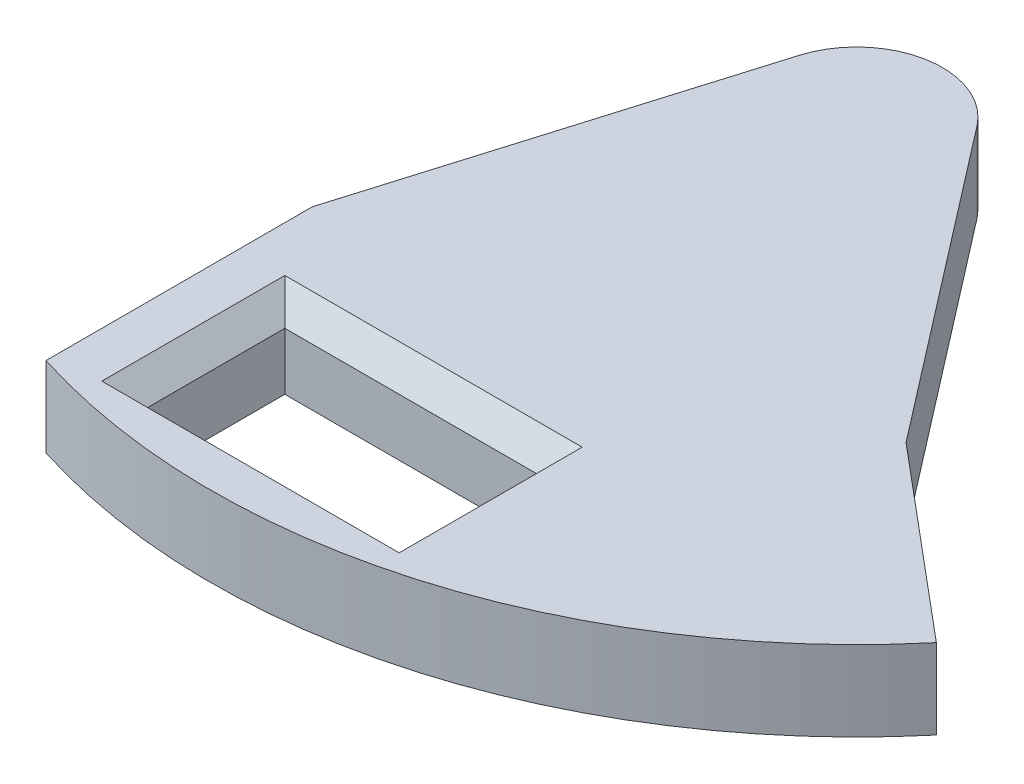
ISO-10303-21;
HEADER;
FILE_DESCRIPTION(('STEP AP214'),'2;1');
FILE_NAME('part.step','',(''),(''),'','','');
FILE_SCHEMA(('AUTOMOTIVE_DESIGN { 1 0 10303 214 1 1 1 1 }'));
ENDSEC;
DATA;
#1=APPLICATION_CONTEXT('core data for automotive mechanical design processes');
#2=APPLICATION_PROTOCOL_DEFINITION('international standard','automotive_design',2000,#1);
#3=PRODUCT_CONTEXT('',#1,'mechanical');
#4=PRODUCT('Part','Part','',(#3));
#5=PRODUCT_RELATED_PRODUCT_CATEGORY('part','',(#4));
#6=PRODUCT_DEFINITION_FORMATION('','',#4);
#7=PRODUCT_DEFINITION_CONTEXT('part definition',#1,'design');
#8=PRODUCT_DEFINITION('design','',#6,#7);
#9=PRODUCT_DEFINITION_SHAPE('','',#8);
#10=(LENGTH_UNIT() NAMED_UNIT(*) SI_UNIT(.MILLI.,.METRE.));
#11=(NAMED_UNIT(*) PLANE_ANGLE_UNIT() SI_UNIT($,.RADIAN.));
#12=(NAMED_UNIT(*) SI_UNIT($,.STERADIAN.) SOLID_ANGLE_UNIT());
#13=UNCERTAINTY_MEASURE_WITH_UNIT(LENGTH_MEASURE(1.E-05),#10,'distance_accuracy_value','');
#14=(GEOMETRIC_REPRESENTATION_CONTEXT(3) GLOBAL_UNCERTAINTY_ASSIGNED_CONTEXT((#13)) GLOBAL_UNIT_ASSIGNED_CONTEXT((#10,
#11,#12)) REPRESENTATION_CONTEXT('',''));
#15=CARTESIAN_POINT('',(0.,0.,0.));
#16=DIRECTION('',(0.,0.,1.));
#17=DIRECTION('',(1.,0.,0.));
#18=AXIS2_PLACEMENT_3D('',#15,#16,#17);
#19=CARTESIAN_POINT('',(0.,7.,-6.));
#20=DIRECTION('',(0.,0.,-1.));
#21=DIRECTION('',(-1.,0.,0.));
#22=AXIS2_PLACEMENT_3D('',#19,#20,#21);
#23=PLANE('',#22);
#24=DIRECTION('',(0.,-1.,0.));
#25=VECTOR('',#24,1.);
#26=CARTESIAN_POINT('',(11.,7.,-6.));
#27=LINE('',#26,#25);
#28=CARTESIAN_POINT('',(11.,4.99999999999998,-6.));
#29=VERTEX_POINT('',#28);
#30=CARTESIAN_POINT('',(11.,0.,-6.));
#31=VERTEX_POINT('',#30);
#32=EDGE_CURVE('E201',#29,#31,#27,.T.);
#33=ORIENTED_EDGE('',*,*,#32,.F.);
#34=DIRECTION('',(-1.,0.,0.));
#35=VECTOR('',#34,1.);
#36=CARTESIAN_POINT('',(-11.,4.99999999999998,-6.));
#37=LINE('',#36,#35);
#38=CARTESIAN_POINT('',(-11.,4.99999999999998,-6.));
#39=VERTEX_POINT('',#38);
#40=EDGE_CURVE('E11',#29,#39,#37,.T.);
#41=ORIENTED_EDGE('',*,*,#40,.T.);
#42=DIRECTION('',(0.,-1.,0.));
#43=VECTOR('',#42,1.);
#44=CARTESIAN_POINT('',(-11.,7.,-6.));
#45=LINE('',#44,#43);
#46=CARTESIAN_POINT('',(-11.,0.,-6.));
#47=VERTEX_POINT('',#46);
#48=EDGE_CURVE('E148',#39,#47,#45,.T.);
#49=ORIENTED_EDGE('',*,*,#48,.T.);
#50=DIRECTION('',(1.,0.,0.));
#51=VECTOR('',#50,1.);
#52=CARTESIAN_POINT('',(0.,0.,-6.));
#53=LINE('',#52,#51);
#54=EDGE_CURVE('E188',#47,#31,#53,.T.);
#55=ORIENTED_EDGE('',*,*,#54,.T.);
#56=EDGE_LOOP('',(#33,#41,#49,#55));
#57=FACE_BOUND('',#56,.T.);
#58=ADVANCED_FACE('F47',(#57),#23,.F.);
#59=CARTESIAN_POINT('',(11.,7.,0.));
#60=DIRECTION('',(1.,0.,0.));
#61=DIRECTION('',(0.,0.,-1.));
#62=AXIS2_PLACEMENT_3D('',#59,#60,#61);
#63=PLANE('',#62);
#64=DIRECTION('',(0.,-1.,0.));
#65=VECTOR('',#64,1.);
#66=CARTESIAN_POINT('',(11.,7.,6.));
#67=LINE('',#66,#65);
#68=CARTESIAN_POINT('',(11.,4.99999999999998,6.));
#69=VERTEX_POINT('',#68);
#70=CARTESIAN_POINT('',(11.,0.,6.));
#71=VERTEX_POINT('',#70);
#72=EDGE_CURVE('E199',#69,#71,#67,.T.);
#73=ORIENTED_EDGE('',*,*,#72,.F.);
#74=DIRECTION('',(0.,0.,-1.));
#75=VECTOR('',#74,1.);
#76=CARTESIAN_POINT('',(11.,4.99999999999998,-6.));
#77=LINE('',#76,#75);
#78=EDGE_CURVE('E57',#69,#29,#77,.T.);
#79=ORIENTED_EDGE('',*,*,#78,.T.);
#80=ORIENTED_EDGE('',*,*,#32,.T.);
#81=DIRECTION('',(0.,0.,1.));
#82=VECTOR('',#81,1.);
#83=CARTESIAN_POINT('',(11.,0.,0.));
#84=LINE('',#83,#82);
#85=EDGE_CURVE('E191',#31,#71,#84,.T.);
#86=ORIENTED_EDGE('',*,*,#85,.T.);
#87=EDGE_LOOP('',(#73,#79,#80,#86));
#88=FACE_BOUND('',#87,.T.);
#89=ADVANCED_FACE('F262',(#88),#63,.F.);
#90=CARTESIAN_POINT('',(0.,7.,6.));
#91=DIRECTION('',(0.,0.,-1.));
#92=DIRECTION('',(-1.,0.,0.));
#93=AXIS2_PLACEMENT_3D('',#90,#91,#92);
#94=PLANE('',#93);
#95=DIRECTION('',(0.,-1.,0.));
#96=VECTOR('',#95,1.);
#97=CARTESIAN_POINT('',(-11.,7.,6.));
#98=LINE('',#97,#96);
#99=CARTESIAN_POINT('',(-11.,4.99999999999998,6.));
#100=VERTEX_POINT('',#99);
#101=CARTESIAN_POINT('',(-11.,0.,6.));
#102=VERTEX_POINT('',#101);
#103=EDGE_CURVE('E197',#100,#102,#98,.T.);
#104=ORIENTED_EDGE('',*,*,#103,.F.);
#105=DIRECTION('',(1.,0.,0.));
#106=VECTOR('',#105,1.);
#107=CARTESIAN_POINT('',(0.,4.99999999999998,6.));
#108=LINE('',#107,#106);
#109=EDGE_CURVE('E72',#100,#69,#108,.T.);
#110=ORIENTED_EDGE('',*,*,#109,.T.);
#111=ORIENTED_EDGE('',*,*,#72,.T.);
#112=DIRECTION('',(1.,0.,0.));
#113=VECTOR('',#112,1.);
#114=CARTESIAN_POINT('',(0.,0.,6.));
#115=LINE('',#114,#113);
#116=EDGE_CURVE('E165',#102,#71,#115,.T.);
#117=ORIENTED_EDGE('',*,*,#116,.F.);
#118=EDGE_LOOP('',(#104,#110,#111,#117));
#119=FACE_BOUND('',#118,.T.);
#120=ADVANCED_FACE('F256',(#119),#94,.T.);
#121=CARTESIAN_POINT('',(27.6988737189503,7.,-21.3513240143334));
#122=DIRECTION('',(0.79200869217496,0.,-0.610509812795265));
#123=DIRECTION('',(-0.610509812795265,0.,-0.79200869217496));
#124=AXIS2_PLACEMENT_3D('',#121,#122,#123);
#125=PLANE('',#124);
#126=DIRECTION('',(0.610509812795265,0.,0.79200869217496));
#127=VECTOR('',#126,1.);
#128=CARTESIAN_POINT('',(27.6988737189503,0.,-21.3513240143334));
#129=LINE('',#128,#127);
#130=CARTESIAN_POINT('',(5.9400651913122,0.,-49.5788235959645));
#131=VERTEX_POINT('',#130);
#132=CARTESIAN_POINT('',(26.8115555091642,0.,-22.5024336609712));
#133=VERTEX_POINT('',#132);
#134=EDGE_CURVE('E145',#131,#133,#129,.T.);
#135=ORIENTED_EDGE('',*,*,#134,.F.);
#136=DIRECTION('',(0.,-1.,0.));
#137=VECTOR('',#136,1.);
#138=CARTESIAN_POINT('',(5.9400651913122,7.,-49.5788235959645));
#139=LINE('',#138,#137);
#140=CARTESIAN_POINT('',(5.9400651913122,7.,-49.5788235959645));
#141=VERTEX_POINT('',#140);
#142=EDGE_CURVE('E138',#141,#131,#139,.T.);
#143=ORIENTED_EDGE('',*,*,#142,.F.);
#144=DIRECTION('',(0.610509812795265,0.,0.79200869217496));
#145=VECTOR('',#144,1.);
#146=CARTESIAN_POINT('',(27.6988737189503,7.,-21.3513240143334));
#147=LINE('',#146,#145);
#148=CARTESIAN_POINT('',(26.8115555091642,7.,-22.5024336609712));
#149=VERTEX_POINT('',#148);
#150=EDGE_CURVE('E142',#141,#149,#147,.T.);
#151=ORIENTED_EDGE('',*,*,#150,.T.);
#152=DIRECTION('',(0.,-1.,0.));
#153=VECTOR('',#152,1.);
#154=CARTESIAN_POINT('',(26.8115555091642,7.,-22.5024336609712));
#155=LINE('',#154,#153);
#156=EDGE_CURVE('E174',#149,#133,#155,.T.);
#157=ORIENTED_EDGE('',*,*,#156,.T.);
#158=EDGE_LOOP('',(#135,#143,#151,#157));
#159=FACE_BOUND('',#158,.T.);
#160=ADVANCED_FACE('F140',(#159),#125,.T.);
#161=CARTESIAN_POINT('',(0.,7.,-45.));
#162=DIRECTION('',(0.,-1.,0.));
#163=DIRECTION('',(0.,0.,-1.));
#164=AXIS2_PLACEMENT_3D('',#161,#162,#163);
#165=CYLINDRICAL_SURFACE('',#164,7.5);
#166=CARTESIAN_POINT('',(0.,0.,-45.));
#167=DIRECTION('',(0.,1.,0.));
#168=DIRECTION('',(0.,0.,1.));
#169=AXIS2_PLACEMENT_3D('',#166,#167,#168);
#170=CIRCLE('',#169,7.5);
#171=CARTESIAN_POINT('',(-7.18420804338134,0.,-47.1534053936532));
#172=VERTEX_POINT('',#171);
#173=EDGE_CURVE('E176',#131,#172,#170,.T.);
#174=ORIENTED_EDGE('',*,*,#173,.T.);
#175=DIRECTION('',(0.,-1.,0.));
#176=VECTOR('',#175,1.);
#177=CARTESIAN_POINT('',(-7.18420804338134,7.,-47.1534053936532));
#178=LINE('',#177,#176);
#179=CARTESIAN_POINT('',(-7.18420804338134,7.,-47.1534053936532));
#180=VERTEX_POINT('',#179);
#181=EDGE_CURVE('E149',#180,#172,#178,.T.);
#182=ORIENTED_EDGE('',*,*,#181,.F.);
#183=CARTESIAN_POINT('',(0.,7.,-45.));
#184=DIRECTION('',(0.,1.,0.));
#185=DIRECTION('',(0.,0.,1.));
#186=AXIS2_PLACEMENT_3D('',#183,#184,#185);
#187=CIRCLE('',#186,7.5);
#188=EDGE_CURVE('E152',#141,#180,#187,.T.);
#189=ORIENTED_EDGE('',*,*,#188,.F.);
#190=ORIENTED_EDGE('',*,*,#142,.T.);
#191=EDGE_LOOP('',(#174,#182,#189,#190));
#192=FACE_BOUND('',#191,.T.);
#193=ADVANCED_FACE('F153',(#192),#165,.T.);
#194=CARTESIAN_POINT('',(-19.5606179231768,7.,-5.86312922518512));
#195=DIRECTION('',(0.957894405784179,0.,0.287120719153765));
#196=DIRECTION('',(0.287120719153765,0.,-0.957894405784179));
#197=AXIS2_PLACEMENT_3D('',#194,#195,#196);
#198=PLANE('',#197);
#199=DIRECTION('',(-0.287120719153765,0.,0.957894405784179));
#200=VECTOR('',#199,1.);
#201=CARTESIAN_POINT('',(-19.5606179231768,0.,-5.86312922518512));
#202=LINE('',#201,#200);
#203=CARTESIAN_POINT('',(-17.,0.,-14.4058829184433));
#204=VERTEX_POINT('',#203);
#205=EDGE_CURVE('E178',#172,#204,#202,.T.);
#206=ORIENTED_EDGE('',*,*,#205,.T.);
#207=DIRECTION('',(0.,-1.,0.));
#208=VECTOR('',#207,1.);
#209=CARTESIAN_POINT('',(-17.,7.,-14.4058829184433));
#210=LINE('',#209,#208);
#211=CARTESIAN_POINT('',(-17.,7.,-14.4058829184433));
#212=VERTEX_POINT('',#211);
#213=EDGE_CURVE('E210',#212,#204,#210,.T.);
#214=ORIENTED_EDGE('',*,*,#213,.F.);
#215=DIRECTION('',(-0.287120719153765,0.,0.957894405784179));
#216=VECTOR('',#215,1.);
#217=CARTESIAN_POINT('',(-19.5606179231768,7.,-5.86312922518512));
#218=LINE('',#217,#216);
#219=EDGE_CURVE('E157',#180,#212,#218,.T.);
#220=ORIENTED_EDGE('',*,*,#219,.F.);
#221=ORIENTED_EDGE('',*,*,#181,.T.);
#222=EDGE_LOOP('',(#206,#214,#220,#221));
#223=FACE_BOUND('',#222,.T.);
#224=ADVANCED_FACE('F284',(#223),#198,.F.);
#225=CARTESIAN_POINT('',(-17.,7.,0.));
#226=DIRECTION('',(1.,0.,0.));
#227=DIRECTION('',(0.,0.,-1.));
#228=AXIS2_PLACEMENT_3D('',#225,#226,#227);
#229=PLANE('',#228);
#230=DIRECTION('',(0.,0.,1.));
#231=VECTOR('',#230,1.);
#232=CARTESIAN_POINT('',(-17.,0.,0.));
#233=LINE('',#232,#231);
#234=CARTESIAN_POINT('',(-17.,0.,8.88181511419228));
#235=VERTEX_POINT('',#234);
#236=EDGE_CURVE('E180',#204,#235,#233,.T.);
#237=ORIENTED_EDGE('',*,*,#236,.T.);
#238=DIRECTION('',(0.,-1.,0.));
#239=VECTOR('',#238,1.);
#240=CARTESIAN_POINT('',(-17.,7.,8.88181511419228));
#241=LINE('',#240,#239);
#242=CARTESIAN_POINT('',(-17.,7.,8.88181511419228));
#243=VERTEX_POINT('',#242);
#244=EDGE_CURVE('E207',#243,#235,#241,.T.);
#245=ORIENTED_EDGE('',*,*,#244,.F.);
#246=DIRECTION('',(0.,0.,1.));
#247=VECTOR('',#246,1.);
#248=CARTESIAN_POINT('',(-17.,7.,0.));
#249=LINE('',#248,#247);
#250=EDGE_CURVE('E169',#212,#243,#249,.T.);
#251=ORIENTED_EDGE('',*,*,#250,.F.);
#252=ORIENTED_EDGE('',*,*,#213,.T.);
#253=EDGE_LOOP('',(#237,#245,#251,#252));
#254=FACE_BOUND('',#253,.T.);
#255=ADVANCED_FACE('F280',(#254),#229,.F.);
#256=CARTESIAN_POINT('',(0.,7.,-45.));
#257=DIRECTION('',(0.,-1.,0.));
#258=DIRECTION('',(0.,0.,-1.));
#259=AXIS2_PLACEMENT_3D('',#256,#257,#258);
#260=CYLINDRICAL_SURFACE('',#259,56.5);
#261=CARTESIAN_POINT('',(0.,0.,-45.));
#262=DIRECTION('',(0.,1.,0.));
#263=DIRECTION('',(0.,0.,1.));
#264=AXIS2_PLACEMENT_3D('',#261,#262,#263);
#265=CIRCLE('',#264,56.5);
#266=CARTESIAN_POINT('',(43.2815110362223,0.,-8.68250005271061));
#267=VERTEX_POINT('',#266);
#268=EDGE_CURVE('E182',#235,#267,#265,.T.);
#269=ORIENTED_EDGE('',*,*,#268,.T.);
#270=DIRECTION('',(0.,-1.,0.));
#271=VECTOR('',#270,1.);
#272=CARTESIAN_POINT('',(43.2815110362223,7.,-8.68250005271061));
#273=LINE('',#272,#271);
#274=CARTESIAN_POINT('',(43.2815110362223,7.,-8.68250005271061));
#275=VERTEX_POINT('',#274);
#276=EDGE_CURVE('E205',#275,#267,#273,.T.);
#277=ORIENTED_EDGE('',*,*,#276,.F.);
#278=CARTESIAN_POINT('',(0.,7.,-45.));
#279=DIRECTION('',(0.,1.,0.));
#280=DIRECTION('',(0.,0.,1.));
#281=AXIS2_PLACEMENT_3D('',#278,#279,#280);
#282=CIRCLE('',#281,56.5);
#283=EDGE_CURVE('E171',#243,#275,#282,.T.);
#284=ORIENTED_EDGE('',*,*,#283,.F.);
#285=ORIENTED_EDGE('',*,*,#244,.T.);
#286=EDGE_LOOP('',(#269,#277,#284,#285));
#287=FACE_BOUND('',#286,.T.);
#288=ADVANCED_FACE('F276',(#287),#260,.T.);
#289=CARTESIAN_POINT('',(22.1581744427747,7.,-26.407083997506));
#290=DIRECTION('',(0.642787609686538,0.,-0.766044443118979));
#291=DIRECTION('',(-0.766044443118979,0.,-0.642787609686538));
#292=AXIS2_PLACEMENT_3D('',#289,#290,#291);
#293=PLANE('',#292);
#294=DIRECTION('',(0.766044443118979,0.,0.642787609686538));
#295=VECTOR('',#294,1.);
#296=CARTESIAN_POINT('',(22.1581744427747,0.,-26.407083997506));
#297=LINE('',#296,#295);
#298=EDGE_CURVE('E185',#133,#267,#297,.T.);
#299=ORIENTED_EDGE('',*,*,#298,.F.);
#300=ORIENTED_EDGE('',*,*,#156,.F.);
#301=DIRECTION('',(0.766044443118979,0.,0.642787609686538));
#302=VECTOR('',#301,1.);
#303=CARTESIAN_POINT('',(22.1581744427747,7.,-26.407083997506));
#304=LINE('',#303,#302);
#305=EDGE_CURVE('E161',#149,#275,#304,.T.);
#306=ORIENTED_EDGE('',*,*,#305,.T.);
#307=ORIENTED_EDGE('',*,*,#276,.T.);
#308=EDGE_LOOP('',(#299,#300,#306,#307));
#309=FACE_BOUND('',#308,.T.);
#310=ADVANCED_FACE('F273',(#309),#293,.T.);
#311=CARTESIAN_POINT('',(-11.,7.,0.));
#312=DIRECTION('',(1.,0.,0.));
#313=DIRECTION('',(0.,0.,-1.));
#314=AXIS2_PLACEMENT_3D('',#311,#312,#313);
#315=PLANE('',#314);
#316=ORIENTED_EDGE('',*,*,#48,.F.);
#317=DIRECTION('',(0.,0.,1.));
#318=VECTOR('',#317,1.);
#319=CARTESIAN_POINT('',(-11.,4.99999999999998,0.));
#320=LINE('',#319,#318);
#321=EDGE_CURVE('E203',#39,#100,#320,.T.);
#322=ORIENTED_EDGE('',*,*,#321,.T.);
#323=ORIENTED_EDGE('',*,*,#103,.T.);
#324=DIRECTION('',(0.,0.,1.));
#325=VECTOR('',#324,1.);
#326=CARTESIAN_POINT('',(-11.,0.,0.));
#327=LINE('',#326,#325);
#328=EDGE_CURVE('E162',#47,#102,#327,.T.);
#329=ORIENTED_EDGE('',*,*,#328,.F.);
#330=EDGE_LOOP('',(#316,#322,#323,#329));
#331=FACE_BOUND('',#330,.T.);
#332=ADVANCED_FACE('F253',(#331),#315,.T.);
#333=CARTESIAN_POINT('',(0.,7.,0.));
#334=DIRECTION('',(0.,1.,0.));
#335=DIRECTION('',(0.,0.,1.));
#336=AXIS2_PLACEMENT_3D('',#333,#334,#335);
#337=PLANE('',#336);
#338=DIRECTION('',(-1.,0.,0.));
#339=VECTOR('',#338,1.);
#340=CARTESIAN_POINT('',(0.,7.,8.00000000000001));
#341=LINE('',#340,#339);
#342=CARTESIAN_POINT('',(13.,7.,8.00000000000001));
#343=VERTEX_POINT('',#342);
#344=CARTESIAN_POINT('',(-13.,7.,8.00000000000001));
#345=VERTEX_POINT('',#344);
#346=EDGE_CURVE('E220',#343,#345,#341,.T.);
#347=ORIENTED_EDGE('',*,*,#346,.T.);
#348=DIRECTION('',(0.,0.,-1.));
#349=VECTOR('',#348,1.);
#350=CARTESIAN_POINT('',(-13.,7.,0.));
#351=LINE('',#350,#349);
#352=CARTESIAN_POINT('',(-13.,7.,-8.00000000000001));
#353=VERTEX_POINT('',#352);
#354=EDGE_CURVE('E222',#345,#353,#351,.T.);
#355=ORIENTED_EDGE('',*,*,#354,.T.);
#356=DIRECTION('',(1.,0.,0.));
#357=VECTOR('',#356,1.);
#358=CARTESIAN_POINT('',(11.,7.,-8.00000000000001));
#359=LINE('',#358,#357);
#360=CARTESIAN_POINT('',(13.,7.,-8.00000000000001));
#361=VERTEX_POINT('',#360);
#362=EDGE_CURVE('E216',#353,#361,#359,.T.);
#363=ORIENTED_EDGE('',*,*,#362,.T.);
#364=DIRECTION('',(0.,0.,1.));
#365=VECTOR('',#364,1.);
#366=CARTESIAN_POINT('',(13.,7.,6.));
#367=LINE('',#366,#365);
#368=EDGE_CURVE('E218',#361,#343,#367,.T.);
#369=ORIENTED_EDGE('',*,*,#368,.T.);
#370=EDGE_LOOP('',(#347,#355,#363,#369));
#371=FACE_BOUND('',#370,.T.);
#372=ORIENTED_EDGE('',*,*,#150,.F.);
#373=ORIENTED_EDGE('',*,*,#188,.T.);
#374=ORIENTED_EDGE('',*,*,#219,.T.);
#375=ORIENTED_EDGE('',*,*,#250,.T.);
#376=ORIENTED_EDGE('',*,*,#283,.T.);
#377=ORIENTED_EDGE('',*,*,#305,.F.);
#378=EDGE_LOOP('',(#372,#373,#374,#375,#376,#377));
#379=FACE_BOUND('',#378,.T.);
#380=ADVANCED_FACE('F159',(#371,#379),#337,.T.);
#381=CARTESIAN_POINT('',(0.,0.,0.));
#382=DIRECTION('',(0.,1.,0.));
#383=DIRECTION('',(0.,0.,1.));
#384=AXIS2_PLACEMENT_3D('',#381,#382,#383);
#385=PLANE('',#384);
#386=ORIENTED_EDGE('',*,*,#134,.T.);
#387=ORIENTED_EDGE('',*,*,#298,.T.);
#388=ORIENTED_EDGE('',*,*,#268,.F.);
#389=ORIENTED_EDGE('',*,*,#236,.F.);
#390=ORIENTED_EDGE('',*,*,#205,.F.);
#391=ORIENTED_EDGE('',*,*,#173,.F.);
#392=EDGE_LOOP('',(#386,#387,#388,#389,#390,#391));
#393=FACE_BOUND('',#392,.T.);
#394=ORIENTED_EDGE('',*,*,#54,.F.);
#395=ORIENTED_EDGE('',*,*,#328,.T.);
#396=ORIENTED_EDGE('',*,*,#116,.T.);
#397=ORIENTED_EDGE('',*,*,#85,.F.);
#398=EDGE_LOOP('',(#394,#395,#396,#397));
#399=FACE_BOUND('',#398,.T.);
#400=ADVANCED_FACE('F260',(#393,#399),#385,.F.);
#401=CARTESIAN_POINT('',(13.,7.,0.));
#402=DIRECTION('',(-0.707106781186549,0.707106781186546,0.));
#403=DIRECTION('',(0.,0.,-1.));
#404=AXIS2_PLACEMENT_3D('',#401,#402,#403);
#405=PLANE('',#404);
#406=DIRECTION('',(-0.577350269189625,-0.577350269189627,-0.577350269189625));
#407=VECTOR('',#406,1.);
#408=CARTESIAN_POINT('',(7.33333333333335,1.33333333333332,2.33333333333334));
#409=LINE('',#408,#407);
#410=EDGE_CURVE('E230',#343,#69,#409,.T.);
#411=ORIENTED_EDGE('',*,*,#410,.F.);
#412=ORIENTED_EDGE('',*,*,#368,.F.);
#413=DIRECTION('',(0.577350269189625,0.577350269189627,-0.577350269189625));
#414=VECTOR('',#413,1.);
#415=CARTESIAN_POINT('',(10.3333333333333,4.33333333333333,-5.33333333333334));
#416=LINE('',#415,#414);
#417=EDGE_CURVE('E52',#29,#361,#416,.T.);
#418=ORIENTED_EDGE('',*,*,#417,.F.);
#419=ORIENTED_EDGE('',*,*,#78,.F.);
#420=EDGE_LOOP('',(#411,#412,#418,#419));
#421=FACE_BOUND('',#420,.T.);
#422=ADVANCED_FACE('F50',(#421),#405,.T.);
#423=CARTESIAN_POINT('',(0.,7.,-8.00000000000001));
#424=DIRECTION('',(0.,0.707106781186546,0.707106781186549));
#425=DIRECTION('',(-1.,0.,0.));
#426=AXIS2_PLACEMENT_3D('',#423,#424,#425);
#427=PLANE('',#426);
#428=ORIENTED_EDGE('',*,*,#417,.T.);
#429=ORIENTED_EDGE('',*,*,#362,.F.);
#430=DIRECTION('',(-0.577350269189625,0.577350269189627,-0.577350269189625));
#431=VECTOR('',#430,1.);
#432=CARTESIAN_POINT('',(-9.,2.99999999999998,-4.));
#433=LINE('',#432,#431);
#434=EDGE_CURVE('E229',#39,#353,#433,.T.);
#435=ORIENTED_EDGE('',*,*,#434,.F.);
#436=ORIENTED_EDGE('',*,*,#40,.F.);
#437=EDGE_LOOP('',(#428,#429,#435,#436));
#438=FACE_BOUND('',#437,.T.);
#439=ADVANCED_FACE('F240',(#438),#427,.T.);
#440=CARTESIAN_POINT('',(0.,4.99999999999998,6.));
#441=DIRECTION('',(0.,-0.707106781186546,0.707106781186549));
#442=DIRECTION('',(1.,0.,0.));
#443=AXIS2_PLACEMENT_3D('',#440,#441,#442);
#444=PLANE('',#443);
#445=ORIENTED_EDGE('',*,*,#410,.T.);
#446=ORIENTED_EDGE('',*,*,#109,.F.);
#447=DIRECTION('',(-0.577350269189625,0.577350269189627,0.577350269189625));
#448=VECTOR('',#447,1.);
#449=CARTESIAN_POINT('',(-9.,2.99999999999998,4.00000000000001));
#450=LINE('',#449,#448);
#451=EDGE_CURVE('E227',#345,#100,#450,.F.);
#452=ORIENTED_EDGE('',*,*,#451,.F.);
#453=ORIENTED_EDGE('',*,*,#346,.F.);
#454=EDGE_LOOP('',(#445,#446,#452,#453));
#455=FACE_BOUND('',#454,.T.);
#456=ADVANCED_FACE('F250',(#455),#444,.F.);
#457=CARTESIAN_POINT('',(-11.,4.99999999999998,0.));
#458=DIRECTION('',(-0.707106781186549,-0.707106781186546,0.));
#459=DIRECTION('',(0.,0.,1.));
#460=AXIS2_PLACEMENT_3D('',#457,#458,#459);
#461=PLANE('',#460);
#462=ORIENTED_EDGE('',*,*,#434,.T.);
#463=ORIENTED_EDGE('',*,*,#354,.F.);
#464=ORIENTED_EDGE('',*,*,#451,.T.);
#465=ORIENTED_EDGE('',*,*,#321,.F.);
#466=EDGE_LOOP('',(#462,#463,#464,#465));
#467=FACE_BOUND('',#466,.T.);
#468=ADVANCED_FACE('F248',(#467),#461,.F.);
#469=CLOSED_SHELL('',(#58,#89,#120,#160,#193,#224,#255,#288,#310,#332,#380,#400,#422,#439,#456,#468));
#470=MANIFOLD_SOLID_BREP('B2',#469);
#471=ADVANCED_BREP_SHAPE_REPRESENTATION('',(#18,#470),#14);
#472=SHAPE_DEFINITION_REPRESENTATION(#9,#471);
ENDSEC;
END-ISO-10303-21;
